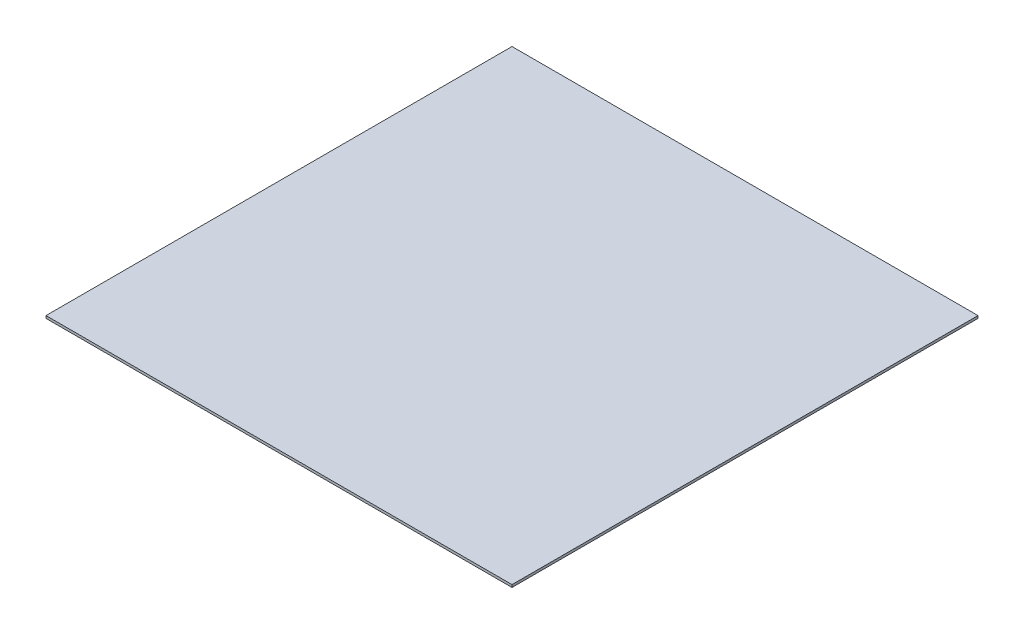
ISO-10303-21;
HEADER;
FILE_DESCRIPTION(('STEP AP214'),'2;1');
FILE_NAME('part.step','',(''),(''),'','','');
FILE_SCHEMA(('AUTOMOTIVE_DESIGN { 1 0 10303 214 1 1 1 1 }'));
ENDSEC;
DATA;
#1=APPLICATION_CONTEXT('core data for automotive mechanical design processes');
#2=APPLICATION_PROTOCOL_DEFINITION('international standard','automotive_design',2000,#1);
#3=PRODUCT_CONTEXT('',#1,'mechanical');
#4=PRODUCT('Part','Part','',(#3));
#5=PRODUCT_RELATED_PRODUCT_CATEGORY('part','',(#4));
#6=PRODUCT_DEFINITION_FORMATION('','',#4);
#7=PRODUCT_DEFINITION_CONTEXT('part definition',#1,'design');
#8=PRODUCT_DEFINITION('design','',#6,#7);
#9=PRODUCT_DEFINITION_SHAPE('','',#8);
#10=(LENGTH_UNIT() NAMED_UNIT(*) SI_UNIT(.MILLI.,.METRE.));
#11=(NAMED_UNIT(*) PLANE_ANGLE_UNIT() SI_UNIT($,.RADIAN.));
#12=(NAMED_UNIT(*) SI_UNIT($,.STERADIAN.) SOLID_ANGLE_UNIT());
#13=UNCERTAINTY_MEASURE_WITH_UNIT(LENGTH_MEASURE(1.E-05),#10,'distance_accuracy_value','');
#14=(GEOMETRIC_REPRESENTATION_CONTEXT(3) GLOBAL_UNCERTAINTY_ASSIGNED_CONTEXT((#13)) GLOBAL_UNIT_ASSIGNED_CONTEXT((#10,
#11,#12)) REPRESENTATION_CONTEXT('',''));
#15=CARTESIAN_POINT('',(0.,0.,0.));
#16=DIRECTION('',(0.,0.,1.));
#17=DIRECTION('',(1.,0.,0.));
#18=AXIS2_PLACEMENT_3D('',#15,#16,#17);
#19=CARTESIAN_POINT('',(0.,1.6,0.));
#20=DIRECTION('',(1.,0.,0.));
#21=DIRECTION('',(0.,0.,-1.));
#22=AXIS2_PLACEMENT_3D('',#19,#20,#21);
#23=PLANE('',#22);
#24=DIRECTION('',(0.,0.,1.));
#25=VECTOR('',#24,1.);
#26=CARTESIAN_POINT('',(0.,0.,0.));
#27=LINE('',#26,#25);
#28=CARTESIAN_POINT('',(0.,0.,-300.));
#29=VERTEX_POINT('',#28);
#30=CARTESIAN_POINT('',(0.,0.,0.));
#31=VERTEX_POINT('',#30);
#32=EDGE_CURVE('E107',#29,#31,#27,.T.);
#33=ORIENTED_EDGE('',*,*,#32,.T.);
#34=DIRECTION('',(0.,-1.,0.));
#35=VECTOR('',#34,1.);
#36=CARTESIAN_POINT('',(0.,1.6,0.));
#37=LINE('',#36,#35);
#38=CARTESIAN_POINT('',(0.,1.6,0.));
#39=VERTEX_POINT('',#38);
#40=EDGE_CURVE('E11',#39,#31,#37,.T.);
#41=ORIENTED_EDGE('',*,*,#40,.F.);
#42=DIRECTION('',(0.,0.,1.));
#43=VECTOR('',#42,1.);
#44=CARTESIAN_POINT('',(0.,1.6,0.));
#45=LINE('',#44,#43);
#46=CARTESIAN_POINT('',(0.,1.6,-300.));
#47=VERTEX_POINT('',#46);
#48=EDGE_CURVE('E91',#47,#39,#45,.T.);
#49=ORIENTED_EDGE('',*,*,#48,.F.);
#50=DIRECTION('',(0.,-1.,0.));
#51=VECTOR('',#50,1.);
#52=CARTESIAN_POINT('',(0.,1.6,-300.));
#53=LINE('',#52,#51);
#54=EDGE_CURVE('E103',#47,#29,#53,.T.);
#55=ORIENTED_EDGE('',*,*,#54,.T.);
#56=EDGE_LOOP('',(#33,#41,#49,#55));
#57=FACE_BOUND('',#56,.T.);
#58=ADVANCED_FACE('F39',(#57),#23,.F.);
#59=CARTESIAN_POINT('',(0.,1.6,0.));
#60=DIRECTION('',(0.,0.,-1.));
#61=DIRECTION('',(-1.,0.,0.));
#62=AXIS2_PLACEMENT_3D('',#59,#60,#61);
#63=PLANE('',#62);
#64=DIRECTION('',(1.,0.,0.));
#65=VECTOR('',#64,1.);
#66=CARTESIAN_POINT('',(0.,0.,0.));
#67=LINE('',#66,#65);
#68=CARTESIAN_POINT('',(300.,0.,0.));
#69=VERTEX_POINT('',#68);
#70=EDGE_CURVE('E96',#31,#69,#67,.T.);
#71=ORIENTED_EDGE('',*,*,#70,.T.);
#72=DIRECTION('',(0.,-1.,0.));
#73=VECTOR('',#72,1.);
#74=CARTESIAN_POINT('',(300.,1.6,0.));
#75=LINE('',#74,#73);
#76=CARTESIAN_POINT('',(300.,1.6,0.));
#77=VERTEX_POINT('',#76);
#78=EDGE_CURVE('E48',#77,#69,#75,.T.);
#79=ORIENTED_EDGE('',*,*,#78,.F.);
#80=DIRECTION('',(1.,0.,0.));
#81=VECTOR('',#80,1.);
#82=CARTESIAN_POINT('',(0.,1.6,0.));
#83=LINE('',#82,#81);
#84=EDGE_CURVE('E86',#39,#77,#83,.T.);
#85=ORIENTED_EDGE('',*,*,#84,.F.);
#86=ORIENTED_EDGE('',*,*,#40,.T.);
#87=EDGE_LOOP('',(#71,#79,#85,#86));
#88=FACE_BOUND('',#87,.T.);
#89=ADVANCED_FACE('F95',(#88),#63,.F.);
#90=CARTESIAN_POINT('',(300.,1.6,0.));
#91=DIRECTION('',(-1.,0.,0.));
#92=DIRECTION('',(0.,0.,1.));
#93=AXIS2_PLACEMENT_3D('',#90,#91,#92);
#94=PLANE('',#93);
#95=DIRECTION('',(0.,0.,-1.));
#96=VECTOR('',#95,1.);
#97=CARTESIAN_POINT('',(300.,0.,0.));
#98=LINE('',#97,#96);
#99=CARTESIAN_POINT('',(300.,0.,-300.));
#100=VERTEX_POINT('',#99);
#101=EDGE_CURVE('E73',#69,#100,#98,.T.);
#102=ORIENTED_EDGE('',*,*,#101,.T.);
#103=DIRECTION('',(0.,-1.,0.));
#104=VECTOR('',#103,1.);
#105=CARTESIAN_POINT('',(300.,1.6,-300.));
#106=LINE('',#105,#104);
#107=CARTESIAN_POINT('',(300.,1.6,-300.));
#108=VERTEX_POINT('',#107);
#109=EDGE_CURVE('E98',#108,#100,#106,.T.);
#110=ORIENTED_EDGE('',*,*,#109,.F.);
#111=DIRECTION('',(0.,0.,-1.));
#112=VECTOR('',#111,1.);
#113=CARTESIAN_POINT('',(300.,1.6,0.));
#114=LINE('',#113,#112);
#115=EDGE_CURVE('E89',#77,#108,#114,.T.);
#116=ORIENTED_EDGE('',*,*,#115,.F.);
#117=ORIENTED_EDGE('',*,*,#78,.T.);
#118=EDGE_LOOP('',(#102,#110,#116,#117));
#119=FACE_BOUND('',#118,.T.);
#120=ADVANCED_FACE('F99',(#119),#94,.F.);
#121=CARTESIAN_POINT('',(0.,1.6,-300.));
#122=DIRECTION('',(0.,0.,1.));
#123=DIRECTION('',(1.,0.,0.));
#124=AXIS2_PLACEMENT_3D('',#121,#122,#123);
#125=PLANE('',#124);
#126=DIRECTION('',(-1.,0.,0.));
#127=VECTOR('',#126,1.);
#128=CARTESIAN_POINT('',(0.,0.,-300.));
#129=LINE('',#128,#127);
#130=EDGE_CURVE('E79',#100,#29,#129,.T.);
#131=ORIENTED_EDGE('',*,*,#130,.T.);
#132=ORIENTED_EDGE('',*,*,#54,.F.);
#133=DIRECTION('',(-1.,0.,0.));
#134=VECTOR('',#133,1.);
#135=CARTESIAN_POINT('',(0.,1.6,-300.));
#136=LINE('',#135,#134);
#137=EDGE_CURVE('E56',#108,#47,#136,.T.);
#138=ORIENTED_EDGE('',*,*,#137,.F.);
#139=ORIENTED_EDGE('',*,*,#109,.T.);
#140=EDGE_LOOP('',(#131,#132,#138,#139));
#141=FACE_BOUND('',#140,.T.);
#142=ADVANCED_FACE('F120',(#141),#125,.F.);
#143=CARTESIAN_POINT('',(0.,1.6,0.));
#144=DIRECTION('',(0.,-1.,0.));
#145=DIRECTION('',(0.,0.,-1.));
#146=AXIS2_PLACEMENT_3D('',#143,#144,#145);
#147=PLANE('',#146);
#148=ORIENTED_EDGE('',*,*,#48,.T.);
#149=ORIENTED_EDGE('',*,*,#84,.T.);
#150=ORIENTED_EDGE('',*,*,#115,.T.);
#151=ORIENTED_EDGE('',*,*,#137,.T.);
#152=EDGE_LOOP('',(#148,#149,#150,#151));
#153=FACE_BOUND('',#152,.T.);
#154=ADVANCED_FACE('F87',(#153),#147,.F.);
#155=CARTESIAN_POINT('',(0.,0.,0.));
#156=DIRECTION('',(0.,-1.,0.));
#157=DIRECTION('',(0.,0.,-1.));
#158=AXIS2_PLACEMENT_3D('',#155,#156,#157);
#159=PLANE('',#158);
#160=ORIENTED_EDGE('',*,*,#32,.F.);
#161=ORIENTED_EDGE('',*,*,#130,.F.);
#162=ORIENTED_EDGE('',*,*,#101,.F.);
#163=ORIENTED_EDGE('',*,*,#70,.F.);
#164=EDGE_LOOP('',(#160,#161,#162,#163));
#165=FACE_BOUND('',#164,.T.);
#166=ADVANCED_FACE('F123',(#165),#159,.T.);
#167=CLOSED_SHELL('',(#58,#89,#120,#142,#154,#166));
#168=MANIFOLD_SOLID_BREP('B2',#167);
#169=ADVANCED_BREP_SHAPE_REPRESENTATION('',(#18,#168),#14);
#170=SHAPE_DEFINITION_REPRESENTATION(#9,#169);
ENDSEC;
END-ISO-10303-21;
